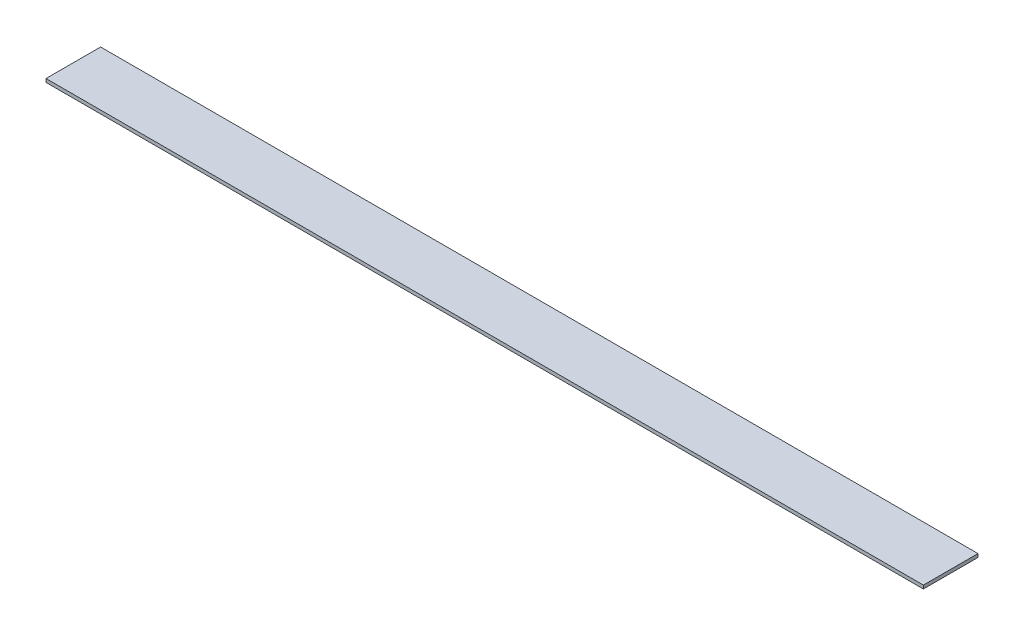
ISO-10303-21;
HEADER;
FILE_DESCRIPTION(('STEP AP214'),'2;1');
FILE_NAME('part.step','',(''),(''),'','','');
FILE_SCHEMA(('AUTOMOTIVE_DESIGN { 1 0 10303 214 1 1 1 1 }'));
ENDSEC;
DATA;
#1=APPLICATION_CONTEXT('core data for automotive mechanical design processes');
#2=APPLICATION_PROTOCOL_DEFINITION('international standard','automotive_design',2000,#1);
#3=PRODUCT_CONTEXT('',#1,'mechanical');
#4=PRODUCT('Part','Part','',(#3));
#5=PRODUCT_RELATED_PRODUCT_CATEGORY('part','',(#4));
#6=PRODUCT_DEFINITION_FORMATION('','',#4);
#7=PRODUCT_DEFINITION_CONTEXT('part definition',#1,'design');
#8=PRODUCT_DEFINITION('design','',#6,#7);
#9=PRODUCT_DEFINITION_SHAPE('','',#8);
#10=(LENGTH_UNIT() NAMED_UNIT(*) SI_UNIT(.MILLI.,.METRE.));
#11=(NAMED_UNIT(*) PLANE_ANGLE_UNIT() SI_UNIT($,.RADIAN.));
#12=(NAMED_UNIT(*) SI_UNIT($,.STERADIAN.) SOLID_ANGLE_UNIT());
#13=UNCERTAINTY_MEASURE_WITH_UNIT(LENGTH_MEASURE(1.E-05),#10,'distance_accuracy_value','');
#14=(GEOMETRIC_REPRESENTATION_CONTEXT(3) GLOBAL_UNCERTAINTY_ASSIGNED_CONTEXT((#13)) GLOBAL_UNIT_ASSIGNED_CONTEXT((#10,
#11,#12)) REPRESENTATION_CONTEXT('',''));
#15=CARTESIAN_POINT('',(0.,0.,0.));
#16=DIRECTION('',(0.,0.,1.));
#17=DIRECTION('',(1.,0.,0.));
#18=AXIS2_PLACEMENT_3D('',#15,#16,#17);
#19=CARTESIAN_POINT('',(0.,3.175,0.));
#20=DIRECTION('',(1.,0.,0.));
#21=DIRECTION('',(0.,0.,-1.));
#22=AXIS2_PLACEMENT_3D('',#19,#20,#21);
#23=PLANE('',#22);
#24=DIRECTION('',(0.,0.,1.));
#25=VECTOR('',#24,1.);
#26=CARTESIAN_POINT('',(0.,0.,0.));
#27=LINE('',#26,#25);
#28=CARTESIAN_POINT('',(0.,0.,-50.8));
#29=VERTEX_POINT('',#28);
#30=CARTESIAN_POINT('',(0.,0.,0.));
#31=VERTEX_POINT('',#30);
#32=EDGE_CURVE('E96',#29,#31,#27,.T.);
#33=ORIENTED_EDGE('',*,*,#32,.T.);
#34=DIRECTION('',(0.,-1.,0.));
#35=VECTOR('',#34,1.);
#36=CARTESIAN_POINT('',(0.,3.175,0.));
#37=LINE('',#36,#35);
#38=CARTESIAN_POINT('',(0.,3.175,0.));
#39=VERTEX_POINT('',#38);
#40=EDGE_CURVE('E11',#39,#31,#37,.T.);
#41=ORIENTED_EDGE('',*,*,#40,.F.);
#42=DIRECTION('',(0.,0.,1.));
#43=VECTOR('',#42,1.);
#44=CARTESIAN_POINT('',(0.,3.175,0.));
#45=LINE('',#44,#43);
#46=CARTESIAN_POINT('',(0.,3.175,-50.8));
#47=VERTEX_POINT('',#46);
#48=EDGE_CURVE('E84',#47,#39,#45,.T.);
#49=ORIENTED_EDGE('',*,*,#48,.F.);
#50=DIRECTION('',(0.,-1.,0.));
#51=VECTOR('',#50,1.);
#52=CARTESIAN_POINT('',(0.,3.175,-50.8));
#53=LINE('',#52,#51);
#54=EDGE_CURVE('E92',#47,#29,#53,.T.);
#55=ORIENTED_EDGE('',*,*,#54,.T.);
#56=EDGE_LOOP('',(#33,#41,#49,#55));
#57=FACE_BOUND('',#56,.T.);
#58=ADVANCED_FACE('F33',(#57),#23,.F.);
#59=CARTESIAN_POINT('',(0.,3.175,0.));
#60=DIRECTION('',(0.,0.,-1.));
#61=DIRECTION('',(-1.,0.,0.));
#62=AXIS2_PLACEMENT_3D('',#59,#60,#61);
#63=PLANE('',#62);
#64=DIRECTION('',(1.,0.,0.));
#65=VECTOR('',#64,1.);
#66=CARTESIAN_POINT('',(0.,0.,0.));
#67=LINE('',#66,#65);
#68=CARTESIAN_POINT('',(816.30012,0.,0.));
#69=VERTEX_POINT('',#68);
#70=EDGE_CURVE('E88',#31,#69,#67,.T.);
#71=ORIENTED_EDGE('',*,*,#70,.T.);
#72=DIRECTION('',(0.,-1.,0.));
#73=VECTOR('',#72,1.);
#74=CARTESIAN_POINT('',(816.30012,3.175,0.));
#75=LINE('',#74,#73);
#76=CARTESIAN_POINT('',(816.30012,3.175,0.));
#77=VERTEX_POINT('',#76);
#78=EDGE_CURVE('E41',#77,#69,#75,.T.);
#79=ORIENTED_EDGE('',*,*,#78,.F.);
#80=DIRECTION('',(1.,0.,0.));
#81=VECTOR('',#80,1.);
#82=CARTESIAN_POINT('',(0.,3.175,0.));
#83=LINE('',#82,#81);
#84=EDGE_CURVE('E79',#39,#77,#83,.T.);
#85=ORIENTED_EDGE('',*,*,#84,.F.);
#86=ORIENTED_EDGE('',*,*,#40,.T.);
#87=EDGE_LOOP('',(#71,#79,#85,#86));
#88=FACE_BOUND('',#87,.T.);
#89=ADVANCED_FACE('F87',(#88),#63,.F.);
#90=CARTESIAN_POINT('',(816.30012,3.175,0.));
#91=DIRECTION('',(-1.,0.,0.));
#92=DIRECTION('',(0.,0.,1.));
#93=AXIS2_PLACEMENT_3D('',#90,#91,#92);
#94=PLANE('',#93);
#95=DIRECTION('',(0.,0.,-1.));
#96=VECTOR('',#95,1.);
#97=CARTESIAN_POINT('',(816.30012,0.,0.));
#98=LINE('',#97,#96);
#99=CARTESIAN_POINT('',(816.30012,0.,-50.8));
#100=VERTEX_POINT('',#99);
#101=EDGE_CURVE('E66',#69,#100,#98,.T.);
#102=ORIENTED_EDGE('',*,*,#101,.T.);
#103=DIRECTION('',(0.,-1.,0.));
#104=VECTOR('',#103,1.);
#105=CARTESIAN_POINT('',(816.30012,3.175,-50.8));
#106=LINE('',#105,#104);
#107=CARTESIAN_POINT('',(816.30012,3.175,-50.8));
#108=VERTEX_POINT('',#107);
#109=EDGE_CURVE('E89',#108,#100,#106,.T.);
#110=ORIENTED_EDGE('',*,*,#109,.F.);
#111=DIRECTION('',(0.,0.,-1.));
#112=VECTOR('',#111,1.);
#113=CARTESIAN_POINT('',(816.30012,3.175,0.));
#114=LINE('',#113,#112);
#115=EDGE_CURVE('E82',#77,#108,#114,.T.);
#116=ORIENTED_EDGE('',*,*,#115,.F.);
#117=ORIENTED_EDGE('',*,*,#78,.T.);
#118=EDGE_LOOP('',(#102,#110,#116,#117));
#119=FACE_BOUND('',#118,.T.);
#120=ADVANCED_FACE('F90',(#119),#94,.F.);
#121=CARTESIAN_POINT('',(0.,3.175,-50.8));
#122=DIRECTION('',(0.,0.,1.));
#123=DIRECTION('',(1.,0.,0.));
#124=AXIS2_PLACEMENT_3D('',#121,#122,#123);
#125=PLANE('',#124);
#126=DIRECTION('',(-1.,0.,0.));
#127=VECTOR('',#126,1.);
#128=CARTESIAN_POINT('',(0.,0.,-50.8));
#129=LINE('',#128,#127);
#130=EDGE_CURVE('E72',#100,#29,#129,.T.);
#131=ORIENTED_EDGE('',*,*,#130,.T.);
#132=ORIENTED_EDGE('',*,*,#54,.F.);
#133=DIRECTION('',(-1.,0.,0.));
#134=VECTOR('',#133,1.);
#135=CARTESIAN_POINT('',(0.,3.175,-50.8));
#136=LINE('',#135,#134);
#137=EDGE_CURVE('E49',#108,#47,#136,.T.);
#138=ORIENTED_EDGE('',*,*,#137,.F.);
#139=ORIENTED_EDGE('',*,*,#109,.T.);
#140=EDGE_LOOP('',(#131,#132,#138,#139));
#141=FACE_BOUND('',#140,.T.);
#142=ADVANCED_FACE('F103',(#141),#125,.F.);
#143=CARTESIAN_POINT('',(0.,3.175,0.));
#144=DIRECTION('',(0.,-1.,0.));
#145=DIRECTION('',(0.,0.,-1.));
#146=AXIS2_PLACEMENT_3D('',#143,#144,#145);
#147=PLANE('',#146);
#148=ORIENTED_EDGE('',*,*,#48,.T.);
#149=ORIENTED_EDGE('',*,*,#84,.T.);
#150=ORIENTED_EDGE('',*,*,#115,.T.);
#151=ORIENTED_EDGE('',*,*,#137,.T.);
#152=EDGE_LOOP('',(#148,#149,#150,#151));
#153=FACE_BOUND('',#152,.T.);
#154=ADVANCED_FACE('F80',(#153),#147,.F.);
#155=CARTESIAN_POINT('',(0.,0.,0.));
#156=DIRECTION('',(0.,-1.,0.));
#157=DIRECTION('',(0.,0.,-1.));
#158=AXIS2_PLACEMENT_3D('',#155,#156,#157);
#159=PLANE('',#158);
#160=ORIENTED_EDGE('',*,*,#32,.F.);
#161=ORIENTED_EDGE('',*,*,#130,.F.);
#162=ORIENTED_EDGE('',*,*,#101,.F.);
#163=ORIENTED_EDGE('',*,*,#70,.F.);
#164=EDGE_LOOP('',(#160,#161,#162,#163));
#165=FACE_BOUND('',#164,.T.);
#166=ADVANCED_FACE('F106',(#165),#159,.T.);
#167=CLOSED_SHELL('',(#58,#89,#120,#142,#154,#166));
#168=MANIFOLD_SOLID_BREP('B2',#167);
#169=ADVANCED_BREP_SHAPE_REPRESENTATION('',(#18,#168),#14);
#170=SHAPE_DEFINITION_REPRESENTATION(#9,#169);
ENDSEC;
END-ISO-10303-21;
